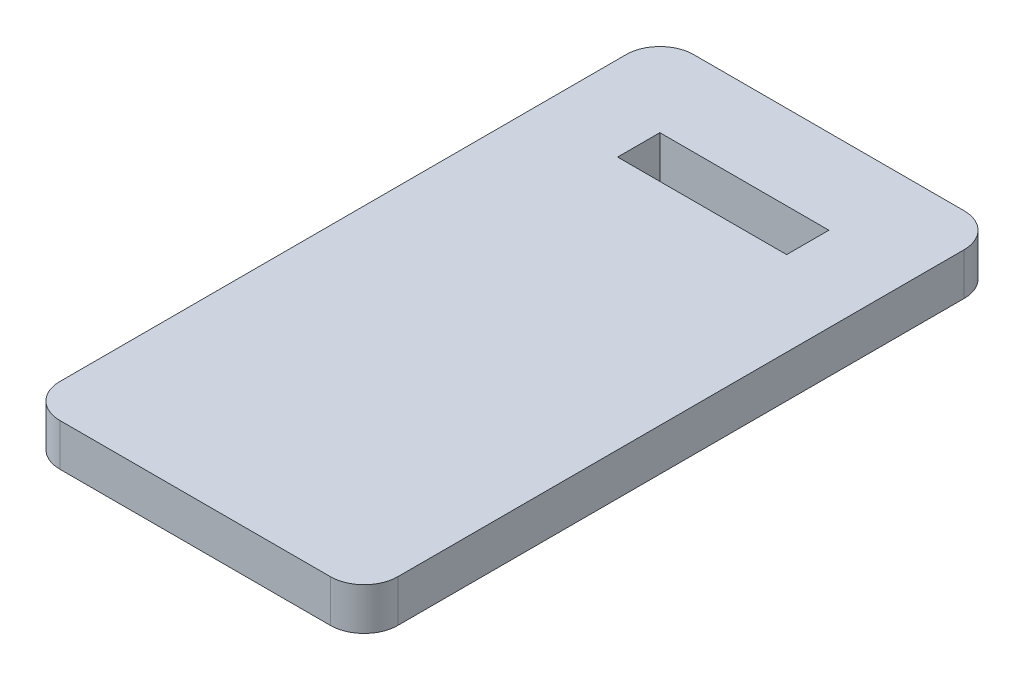
ISO-10303-21;
HEADER;
FILE_DESCRIPTION(('STEP AP214'),'2;1');
FILE_NAME('part.step','',(''),(''),'','','');
FILE_SCHEMA(('AUTOMOTIVE_DESIGN { 1 0 10303 214 1 1 1 1 }'));
ENDSEC;
DATA;
#1=APPLICATION_CONTEXT('core data for automotive mechanical design processes');
#2=APPLICATION_PROTOCOL_DEFINITION('international standard','automotive_design',2000,#1);
#3=PRODUCT_CONTEXT('',#1,'mechanical');
#4=PRODUCT('Part','Part','',(#3));
#5=PRODUCT_RELATED_PRODUCT_CATEGORY('part','',(#4));
#6=PRODUCT_DEFINITION_FORMATION('','',#4);
#7=PRODUCT_DEFINITION_CONTEXT('part definition',#1,'design');
#8=PRODUCT_DEFINITION('design','',#6,#7);
#9=PRODUCT_DEFINITION_SHAPE('','',#8);
#10=(LENGTH_UNIT() NAMED_UNIT(*) SI_UNIT(.MILLI.,.METRE.));
#11=(NAMED_UNIT(*) PLANE_ANGLE_UNIT() SI_UNIT($,.RADIAN.));
#12=(NAMED_UNIT(*) SI_UNIT($,.STERADIAN.) SOLID_ANGLE_UNIT());
#13=UNCERTAINTY_MEASURE_WITH_UNIT(LENGTH_MEASURE(1.E-05),#10,'distance_accuracy_value','');
#14=(GEOMETRIC_REPRESENTATION_CONTEXT(3) GLOBAL_UNCERTAINTY_ASSIGNED_CONTEXT((#13)) GLOBAL_UNIT_ASSIGNED_CONTEXT((#10,
#11,#12)) REPRESENTATION_CONTEXT('',''));
#15=CARTESIAN_POINT('',(0.,0.,0.));
#16=DIRECTION('',(0.,0.,1.));
#17=DIRECTION('',(1.,0.,0.));
#18=AXIS2_PLACEMENT_3D('',#15,#16,#17);
#19=CARTESIAN_POINT('',(0.,3.175,0.));
#20=DIRECTION('',(1.,0.,0.));
#21=DIRECTION('',(0.,0.,-1.));
#22=AXIS2_PLACEMENT_3D('',#19,#20,#21);
#23=PLANE('',#22);
#24=DIRECTION('',(0.,0.,1.));
#25=VECTOR('',#24,1.);
#26=CARTESIAN_POINT('',(0.,3.175,0.));
#27=LINE('',#26,#25);
#28=CARTESIAN_POINT('',(0.,3.175,-45.085));
#29=VERTEX_POINT('',#28);
#30=CARTESIAN_POINT('',(0.,3.175,-2.54));
#31=VERTEX_POINT('',#30);
#32=EDGE_CURVE('E190',#29,#31,#27,.T.);
#33=ORIENTED_EDGE('',*,*,#32,.F.);
#34=DIRECTION('',(0.,-1.,0.));
#35=VECTOR('',#34,1.);
#36=CARTESIAN_POINT('',(0.,3.175,-45.085));
#37=LINE('',#36,#35);
#38=CARTESIAN_POINT('',(0.,0.,-45.085));
#39=VERTEX_POINT('',#38);
#40=EDGE_CURVE('E221',#29,#39,#37,.T.);
#41=ORIENTED_EDGE('',*,*,#40,.T.);
#42=DIRECTION('',(0.,0.,1.));
#43=VECTOR('',#42,1.);
#44=CARTESIAN_POINT('',(0.,0.,0.));
#45=LINE('',#44,#43);
#46=CARTESIAN_POINT('',(0.,0.,-2.54));
#47=VERTEX_POINT('',#46);
#48=EDGE_CURVE('E184',#39,#47,#45,.T.);
#49=ORIENTED_EDGE('',*,*,#48,.T.);
#50=DIRECTION('',(0.,-1.,0.));
#51=VECTOR('',#50,1.);
#52=CARTESIAN_POINT('',(0.,3.175,-2.54));
#53=LINE('',#52,#51);
#54=EDGE_CURVE('E205',#47,#31,#53,.F.);
#55=ORIENTED_EDGE('',*,*,#54,.T.);
#56=EDGE_LOOP('',(#33,#41,#49,#55));
#57=FACE_BOUND('',#56,.T.);
#58=ADVANCED_FACE('F43',(#57),#23,.F.);
#59=CARTESIAN_POINT('',(0.,3.175,0.));
#60=DIRECTION('',(0.,0.,-1.));
#61=DIRECTION('',(-1.,0.,0.));
#62=AXIS2_PLACEMENT_3D('',#59,#60,#61);
#63=PLANE('',#62);
#64=DIRECTION('',(1.,0.,0.));
#65=VECTOR('',#64,1.);
#66=CARTESIAN_POINT('',(0.,0.,0.));
#67=LINE('',#66,#65);
#68=CARTESIAN_POINT('',(2.54,0.,0.));
#69=VERTEX_POINT('',#68);
#70=CARTESIAN_POINT('',(22.86,0.,0.));
#71=VERTEX_POINT('',#70);
#72=EDGE_CURVE('E209',#69,#71,#67,.T.);
#73=ORIENTED_EDGE('',*,*,#72,.T.);
#74=DIRECTION('',(0.,-1.,0.));
#75=VECTOR('',#74,1.);
#76=CARTESIAN_POINT('',(22.86,3.175,0.));
#77=LINE('',#76,#75);
#78=CARTESIAN_POINT('',(22.86,3.175,0.));
#79=VERTEX_POINT('',#78);
#80=EDGE_CURVE('E11',#71,#79,#77,.F.);
#81=ORIENTED_EDGE('',*,*,#80,.T.);
#82=DIRECTION('',(1.,0.,0.));
#83=VECTOR('',#82,1.);
#84=CARTESIAN_POINT('',(0.,3.175,0.));
#85=LINE('',#84,#83);
#86=CARTESIAN_POINT('',(2.54,3.175,0.));
#87=VERTEX_POINT('',#86);
#88=EDGE_CURVE('E194',#87,#79,#85,.T.);
#89=ORIENTED_EDGE('',*,*,#88,.F.);
#90=DIRECTION('',(0.,-1.,0.));
#91=VECTOR('',#90,1.);
#92=CARTESIAN_POINT('',(2.54,3.175,0.));
#93=LINE('',#92,#91);
#94=EDGE_CURVE('E52',#87,#69,#93,.T.);
#95=ORIENTED_EDGE('',*,*,#94,.T.);
#96=EDGE_LOOP('',(#73,#81,#89,#95));
#97=FACE_BOUND('',#96,.T.);
#98=ADVANCED_FACE('F266',(#97),#63,.F.);
#99=CARTESIAN_POINT('',(25.4,3.175,0.));
#100=DIRECTION('',(-1.,0.,0.));
#101=DIRECTION('',(0.,0.,1.));
#102=AXIS2_PLACEMENT_3D('',#99,#100,#101);
#103=PLANE('',#102);
#104=DIRECTION('',(0.,0.,-1.));
#105=VECTOR('',#104,1.);
#106=CARTESIAN_POINT('',(25.4,0.,0.));
#107=LINE('',#106,#105);
#108=CARTESIAN_POINT('',(25.4,0.,-2.54));
#109=VERTEX_POINT('',#108);
#110=CARTESIAN_POINT('',(25.4,0.,-45.085));
#111=VERTEX_POINT('',#110);
#112=EDGE_CURVE('E213',#109,#111,#107,.T.);
#113=ORIENTED_EDGE('',*,*,#112,.T.);
#114=DIRECTION('',(0.,-1.,0.));
#115=VECTOR('',#114,1.);
#116=CARTESIAN_POINT('',(25.4,3.175,-45.085));
#117=LINE('',#116,#115);
#118=CARTESIAN_POINT('',(25.4,3.175,-45.085));
#119=VERTEX_POINT('',#118);
#120=EDGE_CURVE('E59',#111,#119,#117,.F.);
#121=ORIENTED_EDGE('',*,*,#120,.T.);
#122=DIRECTION('',(0.,0.,-1.));
#123=VECTOR('',#122,1.);
#124=CARTESIAN_POINT('',(25.4,3.175,0.));
#125=LINE('',#124,#123);
#126=CARTESIAN_POINT('',(25.4,3.175,-2.54));
#127=VERTEX_POINT('',#126);
#128=EDGE_CURVE('E198',#127,#119,#125,.T.);
#129=ORIENTED_EDGE('',*,*,#128,.F.);
#130=DIRECTION('',(0.,-1.,0.));
#131=VECTOR('',#130,1.);
#132=CARTESIAN_POINT('',(25.4,3.175,-2.54));
#133=LINE('',#132,#131);
#134=EDGE_CURVE('E255',#127,#109,#133,.T.);
#135=ORIENTED_EDGE('',*,*,#134,.T.);
#136=EDGE_LOOP('',(#113,#121,#129,#135));
#137=FACE_BOUND('',#136,.T.);
#138=ADVANCED_FACE('F275',(#137),#103,.F.);
#139=CARTESIAN_POINT('',(0.,3.175,-47.625));
#140=DIRECTION('',(0.,0.,1.));
#141=DIRECTION('',(1.,0.,0.));
#142=AXIS2_PLACEMENT_3D('',#139,#140,#141);
#143=PLANE('',#142);
#144=DIRECTION('',(-1.,0.,0.));
#145=VECTOR('',#144,1.);
#146=CARTESIAN_POINT('',(0.,0.,-47.625));
#147=LINE('',#146,#145);
#148=CARTESIAN_POINT('',(22.86,0.,-47.625));
#149=VERTEX_POINT('',#148);
#150=CARTESIAN_POINT('',(2.54,0.,-47.625));
#151=VERTEX_POINT('',#150);
#152=EDGE_CURVE('E195',#149,#151,#147,.T.);
#153=ORIENTED_EDGE('',*,*,#152,.T.);
#154=DIRECTION('',(0.,-1.,0.));
#155=VECTOR('',#154,1.);
#156=CARTESIAN_POINT('',(2.54,3.175,-47.625));
#157=LINE('',#156,#155);
#158=CARTESIAN_POINT('',(2.54,3.175,-47.625));
#159=VERTEX_POINT('',#158);
#160=EDGE_CURVE('E241',#151,#159,#157,.F.);
#161=ORIENTED_EDGE('',*,*,#160,.T.);
#162=DIRECTION('',(-1.,0.,0.));
#163=VECTOR('',#162,1.);
#164=CARTESIAN_POINT('',(0.,3.175,-47.625));
#165=LINE('',#164,#163);
#166=CARTESIAN_POINT('',(22.86,3.175,-47.625));
#167=VERTEX_POINT('',#166);
#168=EDGE_CURVE('E201',#167,#159,#165,.T.);
#169=ORIENTED_EDGE('',*,*,#168,.F.);
#170=DIRECTION('',(0.,-1.,0.));
#171=VECTOR('',#170,1.);
#172=CARTESIAN_POINT('',(22.86,3.175,-47.625));
#173=LINE('',#172,#171);
#174=EDGE_CURVE('E237',#167,#149,#173,.T.);
#175=ORIENTED_EDGE('',*,*,#174,.T.);
#176=EDGE_LOOP('',(#153,#161,#169,#175));
#177=FACE_BOUND('',#176,.T.);
#178=ADVANCED_FACE('F284',(#177),#143,.F.);
#179=CARTESIAN_POINT('',(0.,3.175,0.));
#180=DIRECTION('',(0.,-1.,0.));
#181=DIRECTION('',(0.,0.,-1.));
#182=AXIS2_PLACEMENT_3D('',#179,#180,#181);
#183=PLANE('',#182);
#184=DIRECTION('',(1.,0.,0.));
#185=VECTOR('',#184,1.);
#186=CARTESIAN_POINT('',(6.35,3.175,-38.1));
#187=LINE('',#186,#185);
#188=CARTESIAN_POINT('',(6.35,3.175,-38.1));
#189=VERTEX_POINT('',#188);
#190=CARTESIAN_POINT('',(19.05,3.175,-38.1));
#191=VERTEX_POINT('',#190);
#192=EDGE_CURVE('E175',#189,#191,#187,.T.);
#193=ORIENTED_EDGE('',*,*,#192,.F.);
#194=DIRECTION('',(0.,0.,1.));
#195=VECTOR('',#194,1.);
#196=CARTESIAN_POINT('',(6.35,3.175,-41.275));
#197=LINE('',#196,#195);
#198=CARTESIAN_POINT('',(6.35,3.175,-41.275));
#199=VERTEX_POINT('',#198);
#200=EDGE_CURVE('E141',#199,#189,#197,.T.);
#201=ORIENTED_EDGE('',*,*,#200,.F.);
#202=DIRECTION('',(-1.,0.,0.));
#203=VECTOR('',#202,1.);
#204=CARTESIAN_POINT('',(6.35,3.175,-41.275));
#205=LINE('',#204,#203);
#206=CARTESIAN_POINT('',(19.05,3.175,-41.275));
#207=VERTEX_POINT('',#206);
#208=EDGE_CURVE('E162',#207,#199,#205,.T.);
#209=ORIENTED_EDGE('',*,*,#208,.F.);
#210=DIRECTION('',(0.,0.,-1.));
#211=VECTOR('',#210,1.);
#212=CARTESIAN_POINT('',(19.05,3.175,-41.275));
#213=LINE('',#212,#211);
#214=EDGE_CURVE('E166',#191,#207,#213,.T.);
#215=ORIENTED_EDGE('',*,*,#214,.F.);
#216=EDGE_LOOP('',(#193,#201,#209,#215));
#217=FACE_BOUND('',#216,.T.);
#218=ORIENTED_EDGE('',*,*,#168,.T.);
#219=CARTESIAN_POINT('',(2.54,3.175,-45.085));
#220=DIRECTION('',(0.,-1.,0.));
#221=DIRECTION('',(0.,0.,-1.));
#222=AXIS2_PLACEMENT_3D('',#219,#220,#221);
#223=CIRCLE('',#222,2.54);
#224=EDGE_CURVE('E252',#159,#29,#223,.F.);
#225=ORIENTED_EDGE('',*,*,#224,.T.);
#226=ORIENTED_EDGE('',*,*,#32,.T.);
#227=CARTESIAN_POINT('',(2.54,3.175,-2.54));
#228=DIRECTION('',(0.,-1.,0.));
#229=DIRECTION('',(0.,0.,-1.));
#230=AXIS2_PLACEMENT_3D('',#227,#228,#229);
#231=CIRCLE('',#230,2.54);
#232=EDGE_CURVE('E244',#31,#87,#231,.F.);
#233=ORIENTED_EDGE('',*,*,#232,.T.);
#234=ORIENTED_EDGE('',*,*,#88,.T.);
#235=CARTESIAN_POINT('',(22.86,3.175,-2.54));
#236=DIRECTION('',(0.,-1.,0.));
#237=DIRECTION('',(0.,0.,-1.));
#238=AXIS2_PLACEMENT_3D('',#235,#236,#237);
#239=CIRCLE('',#238,2.54);
#240=EDGE_CURVE('E66',#79,#127,#239,.F.);
#241=ORIENTED_EDGE('',*,*,#240,.T.);
#242=ORIENTED_EDGE('',*,*,#128,.T.);
#243=CARTESIAN_POINT('',(22.86,3.175,-45.085));
#244=DIRECTION('',(0.,-1.,0.));
#245=DIRECTION('',(0.,0.,-1.));
#246=AXIS2_PLACEMENT_3D('',#243,#244,#245);
#247=CIRCLE('',#246,2.54);
#248=EDGE_CURVE('E249',#119,#167,#247,.F.);
#249=ORIENTED_EDGE('',*,*,#248,.T.);
#250=EDGE_LOOP('',(#218,#225,#226,#233,#234,#241,#242,#249));
#251=FACE_BOUND('',#250,.T.);
#252=ADVANCED_FACE('F277',(#217,#251),#183,.F.);
#253=CARTESIAN_POINT('',(0.,0.,0.));
#254=DIRECTION('',(0.,-1.,0.));
#255=DIRECTION('',(0.,0.,-1.));
#256=AXIS2_PLACEMENT_3D('',#253,#254,#255);
#257=PLANE('',#256);
#258=DIRECTION('',(0.,0.,1.));
#259=VECTOR('',#258,1.);
#260=CARTESIAN_POINT('',(6.35,0.,-41.275));
#261=LINE('',#260,#259);
#262=CARTESIAN_POINT('',(6.35,0.,-41.275));
#263=VERTEX_POINT('',#262);
#264=CARTESIAN_POINT('',(6.35,0.,-38.1));
#265=VERTEX_POINT('',#264);
#266=EDGE_CURVE('E138',#263,#265,#261,.T.);
#267=ORIENTED_EDGE('',*,*,#266,.T.);
#268=DIRECTION('',(1.,0.,0.));
#269=VECTOR('',#268,1.);
#270=CARTESIAN_POINT('',(6.35,0.,-38.1));
#271=LINE('',#270,#269);
#272=CARTESIAN_POINT('',(19.05,0.,-38.1));
#273=VERTEX_POINT('',#272);
#274=EDGE_CURVE('E151',#265,#273,#271,.T.);
#275=ORIENTED_EDGE('',*,*,#274,.T.);
#276=DIRECTION('',(0.,0.,-1.));
#277=VECTOR('',#276,1.);
#278=CARTESIAN_POINT('',(19.05,0.,-41.275));
#279=LINE('',#278,#277);
#280=CARTESIAN_POINT('',(19.05,0.,-41.275));
#281=VERTEX_POINT('',#280);
#282=EDGE_CURVE('E156',#273,#281,#279,.T.);
#283=ORIENTED_EDGE('',*,*,#282,.T.);
#284=DIRECTION('',(-1.,0.,0.));
#285=VECTOR('',#284,1.);
#286=CARTESIAN_POINT('',(6.35,0.,-41.275));
#287=LINE('',#286,#285);
#288=EDGE_CURVE('E147',#281,#263,#287,.T.);
#289=ORIENTED_EDGE('',*,*,#288,.T.);
#290=EDGE_LOOP('',(#267,#275,#283,#289));
#291=FACE_BOUND('',#290,.T.);
#292=ORIENTED_EDGE('',*,*,#48,.F.);
#293=CARTESIAN_POINT('',(2.54,0.,-45.085));
#294=DIRECTION('',(0.,-1.,0.));
#295=DIRECTION('',(0.,0.,-1.));
#296=AXIS2_PLACEMENT_3D('',#293,#294,#295);
#297=CIRCLE('',#296,2.54);
#298=EDGE_CURVE('E234',#39,#151,#297,.T.);
#299=ORIENTED_EDGE('',*,*,#298,.T.);
#300=ORIENTED_EDGE('',*,*,#152,.F.);
#301=CARTESIAN_POINT('',(22.86,0.,-45.085));
#302=DIRECTION('',(0.,-1.,0.));
#303=DIRECTION('',(0.,0.,-1.));
#304=AXIS2_PLACEMENT_3D('',#301,#302,#303);
#305=CIRCLE('',#304,2.54);
#306=EDGE_CURVE('E231',#149,#111,#305,.T.);
#307=ORIENTED_EDGE('',*,*,#306,.T.);
#308=ORIENTED_EDGE('',*,*,#112,.F.);
#309=CARTESIAN_POINT('',(22.86,0.,-2.54));
#310=DIRECTION('',(0.,-1.,0.));
#311=DIRECTION('',(0.,0.,-1.));
#312=AXIS2_PLACEMENT_3D('',#309,#310,#311);
#313=CIRCLE('',#312,2.54);
#314=EDGE_CURVE('E228',#109,#71,#313,.T.);
#315=ORIENTED_EDGE('',*,*,#314,.T.);
#316=ORIENTED_EDGE('',*,*,#72,.F.);
#317=CARTESIAN_POINT('',(2.54,0.,-2.54));
#318=DIRECTION('',(0.,-1.,0.));
#319=DIRECTION('',(0.,0.,-1.));
#320=AXIS2_PLACEMENT_3D('',#317,#318,#319);
#321=CIRCLE('',#320,2.54);
#322=EDGE_CURVE('E225',#69,#47,#321,.T.);
#323=ORIENTED_EDGE('',*,*,#322,.T.);
#324=EDGE_LOOP('',(#292,#299,#300,#307,#308,#315,#316,#323));
#325=FACE_BOUND('',#324,.T.);
#326=ADVANCED_FACE('F158',(#291,#325),#257,.T.);
#327=CARTESIAN_POINT('',(6.35,0.,-41.275));
#328=DIRECTION('',(-1.,0.,0.));
#329=DIRECTION('',(0.,0.,1.));
#330=AXIS2_PLACEMENT_3D('',#327,#328,#329);
#331=PLANE('',#330);
#332=ORIENTED_EDGE('',*,*,#200,.T.);
#333=DIRECTION('',(0.,1.,0.));
#334=VECTOR('',#333,1.);
#335=CARTESIAN_POINT('',(6.35,0.,-38.1));
#336=LINE('',#335,#334);
#337=EDGE_CURVE('E134',#265,#189,#336,.T.);
#338=ORIENTED_EDGE('',*,*,#337,.F.);
#339=ORIENTED_EDGE('',*,*,#266,.F.);
#340=DIRECTION('',(0.,1.,0.));
#341=VECTOR('',#340,1.);
#342=CARTESIAN_POINT('',(6.35,0.,-41.275));
#343=LINE('',#342,#341);
#344=EDGE_CURVE('E181',#263,#199,#343,.T.);
#345=ORIENTED_EDGE('',*,*,#344,.T.);
#346=EDGE_LOOP('',(#332,#338,#339,#345));
#347=FACE_BOUND('',#346,.T.);
#348=ADVANCED_FACE('F136',(#347),#331,.F.);
#349=CARTESIAN_POINT('',(6.35,0.,-41.275));
#350=DIRECTION('',(0.,0.,-1.));
#351=DIRECTION('',(-1.,0.,0.));
#352=AXIS2_PLACEMENT_3D('',#349,#350,#351);
#353=PLANE('',#352);
#354=ORIENTED_EDGE('',*,*,#208,.T.);
#355=ORIENTED_EDGE('',*,*,#344,.F.);
#356=ORIENTED_EDGE('',*,*,#288,.F.);
#357=DIRECTION('',(0.,1.,0.));
#358=VECTOR('',#357,1.);
#359=CARTESIAN_POINT('',(19.05,0.,-41.275));
#360=LINE('',#359,#358);
#361=EDGE_CURVE('E185',#281,#207,#360,.T.);
#362=ORIENTED_EDGE('',*,*,#361,.T.);
#363=EDGE_LOOP('',(#354,#355,#356,#362));
#364=FACE_BOUND('',#363,.T.);
#365=ADVANCED_FACE('F351',(#364),#353,.F.);
#366=CARTESIAN_POINT('',(19.05,0.,-41.275));
#367=DIRECTION('',(1.,0.,0.));
#368=DIRECTION('',(0.,0.,-1.));
#369=AXIS2_PLACEMENT_3D('',#366,#367,#368);
#370=PLANE('',#369);
#371=ORIENTED_EDGE('',*,*,#214,.T.);
#372=ORIENTED_EDGE('',*,*,#361,.F.);
#373=ORIENTED_EDGE('',*,*,#282,.F.);
#374=DIRECTION('',(0.,1.,0.));
#375=VECTOR('',#374,1.);
#376=CARTESIAN_POINT('',(19.05,0.,-38.1));
#377=LINE('',#376,#375);
#378=EDGE_CURVE('E146',#273,#191,#377,.T.);
#379=ORIENTED_EDGE('',*,*,#378,.T.);
#380=EDGE_LOOP('',(#371,#372,#373,#379));
#381=FACE_BOUND('',#380,.T.);
#382=ADVANCED_FACE('F342',(#381),#370,.F.);
#383=CARTESIAN_POINT('',(6.35,0.,-38.1));
#384=DIRECTION('',(0.,0.,1.));
#385=DIRECTION('',(1.,0.,0.));
#386=AXIS2_PLACEMENT_3D('',#383,#384,#385);
#387=PLANE('',#386);
#388=ORIENTED_EDGE('',*,*,#192,.T.);
#389=ORIENTED_EDGE('',*,*,#378,.F.);
#390=ORIENTED_EDGE('',*,*,#274,.F.);
#391=ORIENTED_EDGE('',*,*,#337,.T.);
#392=EDGE_LOOP('',(#388,#389,#390,#391));
#393=FACE_BOUND('',#392,.T.);
#394=ADVANCED_FACE('F152',(#393),#387,.F.);
#395=CARTESIAN_POINT('',(2.54,3.175,-45.085));
#396=DIRECTION('',(0.,-1.,0.));
#397=DIRECTION('',(0.,0.,-1.));
#398=AXIS2_PLACEMENT_3D('',#395,#396,#397);
#399=CYLINDRICAL_SURFACE('',#398,2.54);
#400=ORIENTED_EDGE('',*,*,#224,.F.);
#401=ORIENTED_EDGE('',*,*,#160,.F.);
#402=ORIENTED_EDGE('',*,*,#298,.F.);
#403=ORIENTED_EDGE('',*,*,#40,.F.);
#404=EDGE_LOOP('',(#400,#401,#402,#403));
#405=FACE_BOUND('',#404,.T.);
#406=ADVANCED_FACE('F289',(#405),#399,.T.);
#407=CARTESIAN_POINT('',(22.86,3.175,-45.085));
#408=DIRECTION('',(0.,-1.,0.));
#409=DIRECTION('',(0.,0.,-1.));
#410=AXIS2_PLACEMENT_3D('',#407,#408,#409);
#411=CYLINDRICAL_SURFACE('',#410,2.54);
#412=ORIENTED_EDGE('',*,*,#248,.F.);
#413=ORIENTED_EDGE('',*,*,#120,.F.);
#414=ORIENTED_EDGE('',*,*,#306,.F.);
#415=ORIENTED_EDGE('',*,*,#174,.F.);
#416=EDGE_LOOP('',(#412,#413,#414,#415));
#417=FACE_BOUND('',#416,.T.);
#418=ADVANCED_FACE('F281',(#417),#411,.T.);
#419=CARTESIAN_POINT('',(22.86,3.175,-2.54));
#420=DIRECTION('',(0.,-1.,0.));
#421=DIRECTION('',(0.,0.,-1.));
#422=AXIS2_PLACEMENT_3D('',#419,#420,#421);
#423=CYLINDRICAL_SURFACE('',#422,2.54);
#424=ORIENTED_EDGE('',*,*,#240,.F.);
#425=ORIENTED_EDGE('',*,*,#80,.F.);
#426=ORIENTED_EDGE('',*,*,#314,.F.);
#427=ORIENTED_EDGE('',*,*,#134,.F.);
#428=EDGE_LOOP('',(#424,#425,#426,#427));
#429=FACE_BOUND('',#428,.T.);
#430=ADVANCED_FACE('F274',(#429),#423,.T.);
#431=CARTESIAN_POINT('',(2.54,3.175,-2.54));
#432=DIRECTION('',(0.,-1.,0.));
#433=DIRECTION('',(0.,0.,-1.));
#434=AXIS2_PLACEMENT_3D('',#431,#432,#433);
#435=CYLINDRICAL_SURFACE('',#434,2.54);
#436=ORIENTED_EDGE('',*,*,#232,.F.);
#437=ORIENTED_EDGE('',*,*,#54,.F.);
#438=ORIENTED_EDGE('',*,*,#322,.F.);
#439=ORIENTED_EDGE('',*,*,#94,.F.);
#440=EDGE_LOOP('',(#436,#437,#438,#439));
#441=FACE_BOUND('',#440,.T.);
#442=ADVANCED_FACE('F45',(#441),#435,.T.);
#443=CLOSED_SHELL('',(#58,#98,#138,#178,#252,#326,#348,#365,#382,#394,#406,#418,#430,#442));
#444=MANIFOLD_SOLID_BREP('B2',#443);
#445=ADVANCED_BREP_SHAPE_REPRESENTATION('',(#18,#444),#14);
#446=SHAPE_DEFINITION_REPRESENTATION(#9,#445);
ENDSEC;
END-ISO-10303-21;
